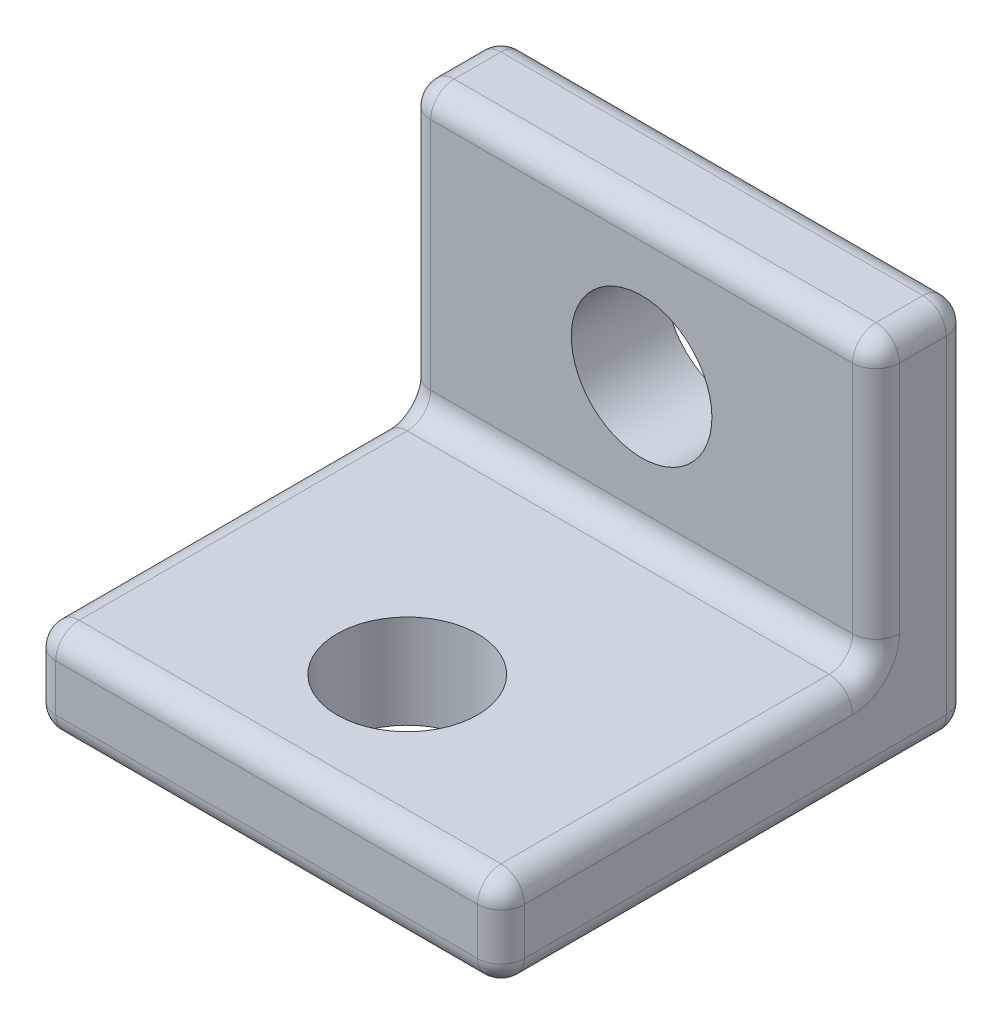
ISO-10303-21;
HEADER;
FILE_DESCRIPTION(('STEP AP214'),'2;1');
FILE_NAME('part.step','',(''),(''),'','','');
FILE_SCHEMA(('AUTOMOTIVE_DESIGN { 1 0 10303 214 1 1 1 1 }'));
ENDSEC;
DATA;
#1=APPLICATION_CONTEXT('core data for automotive mechanical design processes');
#2=APPLICATION_PROTOCOL_DEFINITION('international standard','automotive_design',2000,#1);
#3=PRODUCT_CONTEXT('',#1,'mechanical');
#4=PRODUCT('Part','Part','',(#3));
#5=PRODUCT_RELATED_PRODUCT_CATEGORY('part','',(#4));
#6=PRODUCT_DEFINITION_FORMATION('','',#4);
#7=PRODUCT_DEFINITION_CONTEXT('part definition',#1,'design');
#8=PRODUCT_DEFINITION('design','',#6,#7);
#9=PRODUCT_DEFINITION_SHAPE('','',#8);
#10=(LENGTH_UNIT() NAMED_UNIT(*) SI_UNIT(.MILLI.,.METRE.));
#11=(NAMED_UNIT(*) PLANE_ANGLE_UNIT() SI_UNIT($,.RADIAN.));
#12=(NAMED_UNIT(*) SI_UNIT($,.STERADIAN.) SOLID_ANGLE_UNIT());
#13=UNCERTAINTY_MEASURE_WITH_UNIT(LENGTH_MEASURE(1.E-05),#10,'distance_accuracy_value','');
#14=(GEOMETRIC_REPRESENTATION_CONTEXT(3) GLOBAL_UNCERTAINTY_ASSIGNED_CONTEXT((#13)) GLOBAL_UNIT_ASSIGNED_CONTEXT((#10,
#11,#12)) REPRESENTATION_CONTEXT('',''));
#15=CARTESIAN_POINT('',(0.,0.,0.));
#16=DIRECTION('',(0.,0.,1.));
#17=DIRECTION('',(1.,0.,0.));
#18=AXIS2_PLACEMENT_3D('',#15,#16,#17);
#19=CARTESIAN_POINT('',(5.,2.,-4.));
#20=DIRECTION('',(-1.,0.,0.));
#21=DIRECTION('',(0.,0.,1.));
#22=AXIS2_PLACEMENT_3D('',#19,#20,#21);
#23=PLANE('',#22);
#24=DIRECTION('',(0.,0.,-1.));
#25=VECTOR('',#24,1.);
#26=CARTESIAN_POINT('',(5.,0.5,-4.));
#27=LINE('',#26,#25);
#28=CARTESIAN_POINT('',(5.,0.5,3.5));
#29=VERTEX_POINT('',#28);
#30=CARTESIAN_POINT('',(5.,0.5,-5.5));
#31=VERTEX_POINT('',#30);
#32=EDGE_CURVE('E261',#29,#31,#27,.T.);
#33=ORIENTED_EDGE('',*,*,#32,.T.);
#34=DIRECTION('',(0.,-1.,0.));
#35=VECTOR('',#34,1.);
#36=CARTESIAN_POINT('',(5.,2.,-5.5));
#37=LINE('',#36,#35);
#38=CARTESIAN_POINT('',(5.,7.5,-5.5));
#39=VERTEX_POINT('',#38);
#40=EDGE_CURVE('E265',#31,#39,#37,.F.);
#41=ORIENTED_EDGE('',*,*,#40,.T.);
#42=DIRECTION('',(0.,0.,-1.));
#43=VECTOR('',#42,1.);
#44=CARTESIAN_POINT('',(5.,7.5,-4.));
#45=LINE('',#44,#43);
#46=CARTESIAN_POINT('',(5.,7.5,-4.5));
#47=VERTEX_POINT('',#46);
#48=EDGE_CURVE('E258',#39,#47,#45,.F.);
#49=ORIENTED_EDGE('',*,*,#48,.T.);
#50=DIRECTION('',(0.,-1.,0.));
#51=VECTOR('',#50,1.);
#52=CARTESIAN_POINT('',(5.,2.,-4.5));
#53=LINE('',#52,#51);
#54=CARTESIAN_POINT('',(5.,2.5,-4.5));
#55=VERTEX_POINT('',#54);
#56=EDGE_CURVE('E255',#47,#55,#53,.T.);
#57=ORIENTED_EDGE('',*,*,#56,.T.);
#58=CARTESIAN_POINT('',(5.,2.5,-3.5));
#59=DIRECTION('',(-1.,0.,0.));
#60=DIRECTION('',(0.,0.,1.));
#61=AXIS2_PLACEMENT_3D('',#58,#59,#60);
#62=CIRCLE('',#61,1.);
#63=CARTESIAN_POINT('',(5.,1.5,-3.5));
#64=VERTEX_POINT('',#63);
#65=EDGE_CURVE('E251',#64,#55,#62,.F.);
#66=ORIENTED_EDGE('',*,*,#65,.F.);
#67=DIRECTION('',(0.,0.,-1.));
#68=VECTOR('',#67,1.);
#69=CARTESIAN_POINT('',(5.,1.5,4.));
#70=LINE('',#69,#68);
#71=CARTESIAN_POINT('',(5.,1.5,3.5));
#72=VERTEX_POINT('',#71);
#73=EDGE_CURVE('E248',#64,#72,#70,.F.);
#74=ORIENTED_EDGE('',*,*,#73,.T.);
#75=DIRECTION('',(0.,-1.,0.));
#76=VECTOR('',#75,1.);
#77=CARTESIAN_POINT('',(5.,2.,3.5));
#78=LINE('',#77,#76);
#79=EDGE_CURVE('E245',#72,#29,#78,.T.);
#80=ORIENTED_EDGE('',*,*,#79,.T.);
#81=EDGE_LOOP('',(#33,#41,#49,#57,#66,#74,#80));
#82=FACE_BOUND('',#81,.T.);
#83=ADVANCED_FACE('F45',(#82),#23,.F.);
#84=CARTESIAN_POINT('',(-5.,2.,-4.));
#85=DIRECTION('',(1.,0.,0.));
#86=DIRECTION('',(0.,0.,-1.));
#87=AXIS2_PLACEMENT_3D('',#84,#85,#86);
#88=PLANE('',#87);
#89=DIRECTION('',(0.,-1.,0.));
#90=VECTOR('',#89,1.);
#91=CARTESIAN_POINT('',(-5.,2.,-4.5));
#92=LINE('',#91,#90);
#93=CARTESIAN_POINT('',(-5.,2.5,-4.5));
#94=VERTEX_POINT('',#93);
#95=CARTESIAN_POINT('',(-5.,7.5,-4.5));
#96=VERTEX_POINT('',#95);
#97=EDGE_CURVE('E295',#94,#96,#92,.F.);
#98=ORIENTED_EDGE('',*,*,#97,.T.);
#99=DIRECTION('',(0.,0.,1.));
#100=VECTOR('',#99,1.);
#101=CARTESIAN_POINT('',(-5.,7.5,-6.));
#102=LINE('',#101,#100);
#103=CARTESIAN_POINT('',(-5.,7.5,-5.5));
#104=VERTEX_POINT('',#103);
#105=EDGE_CURVE('E301',#96,#104,#102,.F.);
#106=ORIENTED_EDGE('',*,*,#105,.T.);
#107=DIRECTION('',(0.,-1.,0.));
#108=VECTOR('',#107,1.);
#109=CARTESIAN_POINT('',(-5.,2.,-5.5));
#110=LINE('',#109,#108);
#111=CARTESIAN_POINT('',(-5.,0.5,-5.5));
#112=VERTEX_POINT('',#111);
#113=EDGE_CURVE('E298',#104,#112,#110,.T.);
#114=ORIENTED_EDGE('',*,*,#113,.T.);
#115=DIRECTION('',(0.,0.,1.));
#116=VECTOR('',#115,1.);
#117=CARTESIAN_POINT('',(-5.,0.5,-4.));
#118=LINE('',#117,#116);
#119=CARTESIAN_POINT('',(-5.,0.5,3.5));
#120=VERTEX_POINT('',#119);
#121=EDGE_CURVE('E287',#112,#120,#118,.T.);
#122=ORIENTED_EDGE('',*,*,#121,.T.);
#123=DIRECTION('',(0.,-1.,0.));
#124=VECTOR('',#123,1.);
#125=CARTESIAN_POINT('',(-5.,2.,3.5));
#126=LINE('',#125,#124);
#127=CARTESIAN_POINT('',(-5.,1.5,3.5));
#128=VERTEX_POINT('',#127);
#129=EDGE_CURVE('E281',#120,#128,#126,.F.);
#130=ORIENTED_EDGE('',*,*,#129,.T.);
#131=DIRECTION('',(0.,0.,1.));
#132=VECTOR('',#131,1.);
#133=CARTESIAN_POINT('',(-5.,1.5,-4.));
#134=LINE('',#133,#132);
#135=CARTESIAN_POINT('',(-5.,1.5,-3.5));
#136=VERTEX_POINT('',#135);
#137=EDGE_CURVE('E284',#128,#136,#134,.F.);
#138=ORIENTED_EDGE('',*,*,#137,.T.);
#139=CARTESIAN_POINT('',(-5.,2.5,-3.5));
#140=DIRECTION('',(1.,0.,0.));
#141=DIRECTION('',(0.,0.,-1.));
#142=AXIS2_PLACEMENT_3D('',#139,#140,#141);
#143=CIRCLE('',#142,1.);
#144=EDGE_CURVE('E291',#94,#136,#143,.F.);
#145=ORIENTED_EDGE('',*,*,#144,.F.);
#146=EDGE_LOOP('',(#98,#106,#114,#122,#130,#138,#145));
#147=FACE_BOUND('',#146,.T.);
#148=ADVANCED_FACE('F488',(#147),#88,.F.);
#149=CARTESIAN_POINT('',(-5.,2.,4.));
#150=DIRECTION('',(0.,0.,-1.));
#151=DIRECTION('',(-1.,0.,0.));
#152=AXIS2_PLACEMENT_3D('',#149,#150,#151);
#153=PLANE('',#152);
#154=DIRECTION('',(0.,-1.,0.));
#155=VECTOR('',#154,1.);
#156=CARTESIAN_POINT('',(-4.5,2.,4.));
#157=LINE('',#156,#155);
#158=CARTESIAN_POINT('',(-4.5,1.5,4.));
#159=VERTEX_POINT('',#158);
#160=CARTESIAN_POINT('',(-4.5,0.5,4.));
#161=VERTEX_POINT('',#160);
#162=EDGE_CURVE('E268',#159,#161,#157,.T.);
#163=ORIENTED_EDGE('',*,*,#162,.T.);
#164=DIRECTION('',(1.,0.,0.));
#165=VECTOR('',#164,1.);
#166=CARTESIAN_POINT('',(-5.,0.5,4.));
#167=LINE('',#166,#165);
#168=CARTESIAN_POINT('',(4.5,0.5,4.));
#169=VERTEX_POINT('',#168);
#170=EDGE_CURVE('E277',#161,#169,#167,.T.);
#171=ORIENTED_EDGE('',*,*,#170,.T.);
#172=DIRECTION('',(0.,-1.,0.));
#173=VECTOR('',#172,1.);
#174=CARTESIAN_POINT('',(4.5,2.,4.));
#175=LINE('',#174,#173);
#176=CARTESIAN_POINT('',(4.5,1.5,4.));
#177=VERTEX_POINT('',#176);
#178=EDGE_CURVE('E274',#169,#177,#175,.F.);
#179=ORIENTED_EDGE('',*,*,#178,.T.);
#180=DIRECTION('',(1.,0.,0.));
#181=VECTOR('',#180,1.);
#182=CARTESIAN_POINT('',(-5.,1.5,4.));
#183=LINE('',#182,#181);
#184=EDGE_CURVE('E271',#177,#159,#183,.F.);
#185=ORIENTED_EDGE('',*,*,#184,.T.);
#186=EDGE_LOOP('',(#163,#171,#179,#185));
#187=FACE_BOUND('',#186,.T.);
#188=ADVANCED_FACE('F480',(#187),#153,.F.);
#189=CARTESIAN_POINT('',(0.,2.,0.));
#190=DIRECTION('',(0.,1.,0.));
#191=DIRECTION('',(0.,0.,1.));
#192=AXIS2_PLACEMENT_3D('',#189,#190,#191);
#193=PLANE('',#192);
#194=DIRECTION('',(1.,0.,0.));
#195=VECTOR('',#194,1.);
#196=CARTESIAN_POINT('',(5.,2.,3.5));
#197=LINE('',#196,#195);
#198=CARTESIAN_POINT('',(-4.5,2.,3.5));
#199=VERTEX_POINT('',#198);
#200=CARTESIAN_POINT('',(4.5,2.,3.5));
#201=VERTEX_POINT('',#200);
#202=EDGE_CURVE('E55',#199,#201,#197,.T.);
#203=ORIENTED_EDGE('',*,*,#202,.T.);
#204=DIRECTION('',(0.,0.,-1.));
#205=VECTOR('',#204,1.);
#206=CARTESIAN_POINT('',(4.5,2.,-4.));
#207=LINE('',#206,#205);
#208=CARTESIAN_POINT('',(4.5,2.,-3.5));
#209=VERTEX_POINT('',#208);
#210=EDGE_CURVE('E11',#201,#209,#207,.T.);
#211=ORIENTED_EDGE('',*,*,#210,.T.);
#212=DIRECTION('',(-1.,0.,0.));
#213=VECTOR('',#212,1.);
#214=CARTESIAN_POINT('',(0.,2.,-3.5));
#215=LINE('',#214,#213);
#216=CARTESIAN_POINT('',(-4.5,2.,-3.5));
#217=VERTEX_POINT('',#216);
#218=EDGE_CURVE('E332',#209,#217,#215,.T.);
#219=ORIENTED_EDGE('',*,*,#218,.T.);
#220=DIRECTION('',(0.,0.,1.));
#221=VECTOR('',#220,1.);
#222=CARTESIAN_POINT('',(-4.5,2.,4.));
#223=LINE('',#222,#221);
#224=EDGE_CURVE('E329',#217,#199,#223,.T.);
#225=ORIENTED_EDGE('',*,*,#224,.T.);
#226=EDGE_LOOP('',(#203,#211,#219,#225));
#227=FACE_BOUND('',#226,.T.);
#228=CARTESIAN_POINT('',(0.,2.,1.));
#229=DIRECTION('',(0.,1.,0.));
#230=DIRECTION('',(0.,0.,1.));
#231=AXIS2_PLACEMENT_3D('',#228,#229,#230);
#232=CIRCLE('',#231,1.5);
#233=CARTESIAN_POINT('',(0.,2.,2.5));
#234=VERTEX_POINT('',#233);
#235=EDGE_CURVE('E223',#234,#234,#232,.T.);
#236=ORIENTED_EDGE('',*,*,#235,.F.);
#237=EDGE_LOOP('',(#236));
#238=FACE_BOUND('',#237,.T.);
#239=ADVANCED_FACE('F477',(#227,#238),#193,.T.);
#240=CARTESIAN_POINT('',(0.,0.,0.));
#241=DIRECTION('',(0.,1.,0.));
#242=DIRECTION('',(0.,0.,1.));
#243=AXIS2_PLACEMENT_3D('',#240,#241,#242);
#244=PLANE('',#243);
#245=DIRECTION('',(0.,0.,1.));
#246=VECTOR('',#245,1.);
#247=CARTESIAN_POINT('',(-4.5,0.,0.));
#248=LINE('',#247,#246);
#249=CARTESIAN_POINT('',(-4.5,0.,3.5));
#250=VERTEX_POINT('',#249);
#251=CARTESIAN_POINT('',(-4.5,0.,-5.5));
#252=VERTEX_POINT('',#251);
#253=EDGE_CURVE('E232',#250,#252,#248,.F.);
#254=ORIENTED_EDGE('',*,*,#253,.T.);
#255=DIRECTION('',(-1.,0.,0.));
#256=VECTOR('',#255,1.);
#257=CARTESIAN_POINT('',(0.,0.,-5.5));
#258=LINE('',#257,#256);
#259=CARTESIAN_POINT('',(4.5,0.,-5.5));
#260=VERTEX_POINT('',#259);
#261=EDGE_CURVE('E241',#252,#260,#258,.F.);
#262=ORIENTED_EDGE('',*,*,#261,.T.);
#263=DIRECTION('',(0.,0.,-1.));
#264=VECTOR('',#263,1.);
#265=CARTESIAN_POINT('',(4.5,0.,0.));
#266=LINE('',#265,#264);
#267=CARTESIAN_POINT('',(4.5,0.,3.5));
#268=VERTEX_POINT('',#267);
#269=EDGE_CURVE('E238',#260,#268,#266,.F.);
#270=ORIENTED_EDGE('',*,*,#269,.T.);
#271=DIRECTION('',(1.,0.,0.));
#272=VECTOR('',#271,1.);
#273=CARTESIAN_POINT('',(0.,0.,3.5));
#274=LINE('',#273,#272);
#275=EDGE_CURVE('E235',#268,#250,#274,.F.);
#276=ORIENTED_EDGE('',*,*,#275,.T.);
#277=EDGE_LOOP('',(#254,#262,#270,#276));
#278=FACE_BOUND('',#277,.T.);
#279=CARTESIAN_POINT('',(0.,0.,1.));
#280=DIRECTION('',(0.,1.,0.));
#281=DIRECTION('',(0.,0.,1.));
#282=AXIS2_PLACEMENT_3D('',#279,#280,#281);
#283=CIRCLE('',#282,1.5);
#284=CARTESIAN_POINT('',(0.,0.,2.5));
#285=VERTEX_POINT('',#284);
#286=EDGE_CURVE('E219',#285,#285,#283,.T.);
#287=ORIENTED_EDGE('',*,*,#286,.T.);
#288=EDGE_LOOP('',(#287));
#289=FACE_BOUND('',#288,.T.);
#290=ADVANCED_FACE('F479',(#278,#289),#244,.F.);
#291=CARTESIAN_POINT('',(-5.,8.,-6.));
#292=DIRECTION('',(0.,0.,1.));
#293=DIRECTION('',(1.,0.,0.));
#294=AXIS2_PLACEMENT_3D('',#291,#292,#293);
#295=PLANE('',#294);
#296=DIRECTION('',(0.,-1.,0.));
#297=VECTOR('',#296,1.);
#298=CARTESIAN_POINT('',(4.5,8.,-6.));
#299=LINE('',#298,#297);
#300=CARTESIAN_POINT('',(4.5,7.5,-6.));
#301=VERTEX_POINT('',#300);
#302=CARTESIAN_POINT('',(4.5,0.5,-6.));
#303=VERTEX_POINT('',#302);
#304=EDGE_CURVE('E184',#301,#303,#299,.T.);
#305=ORIENTED_EDGE('',*,*,#304,.T.);
#306=DIRECTION('',(-1.,0.,0.));
#307=VECTOR('',#306,1.);
#308=CARTESIAN_POINT('',(-5.,0.5,-6.));
#309=LINE('',#308,#307);
#310=CARTESIAN_POINT('',(-4.5,0.5,-6.));
#311=VERTEX_POINT('',#310);
#312=EDGE_CURVE('E229',#303,#311,#309,.T.);
#313=ORIENTED_EDGE('',*,*,#312,.T.);
#314=DIRECTION('',(0.,-1.,0.));
#315=VECTOR('',#314,1.);
#316=CARTESIAN_POINT('',(-4.5,8.,-6.));
#317=LINE('',#316,#315);
#318=CARTESIAN_POINT('',(-4.5,7.5,-6.));
#319=VERTEX_POINT('',#318);
#320=EDGE_CURVE('E187',#311,#319,#317,.F.);
#321=ORIENTED_EDGE('',*,*,#320,.T.);
#322=DIRECTION('',(-1.,0.,0.));
#323=VECTOR('',#322,1.);
#324=CARTESIAN_POINT('',(5.,7.5,-6.));
#325=LINE('',#324,#323);
#326=EDGE_CURVE('E178',#319,#301,#325,.F.);
#327=ORIENTED_EDGE('',*,*,#326,.T.);
#328=EDGE_LOOP('',(#305,#313,#321,#327));
#329=FACE_BOUND('',#328,.T.);
#330=CARTESIAN_POINT('',(0.,5.,-6.));
#331=DIRECTION('',(0.,0.,1.));
#332=DIRECTION('',(1.,0.,0.));
#333=AXIS2_PLACEMENT_3D('',#330,#331,#332);
#334=CIRCLE('',#333,1.5);
#335=CARTESIAN_POINT('',(1.5,5.,-6.));
#336=VERTEX_POINT('',#335);
#337=EDGE_CURVE('E463',#336,#336,#334,.T.);
#338=ORIENTED_EDGE('',*,*,#337,.T.);
#339=EDGE_LOOP('',(#338));
#340=FACE_BOUND('',#339,.T.);
#341=ADVANCED_FACE('F180',(#329,#340),#295,.F.);
#342=CARTESIAN_POINT('',(-5.,8.,-4.));
#343=DIRECTION('',(0.,0.,-1.));
#344=DIRECTION('',(-1.,0.,0.));
#345=AXIS2_PLACEMENT_3D('',#342,#343,#344);
#346=PLANE('',#345);
#347=DIRECTION('',(0.,-1.,0.));
#348=VECTOR('',#347,1.);
#349=CARTESIAN_POINT('',(4.5,8.,-4.));
#350=LINE('',#349,#348);
#351=CARTESIAN_POINT('',(4.5,2.5,-4.));
#352=VERTEX_POINT('',#351);
#353=CARTESIAN_POINT('',(4.5,7.5,-4.));
#354=VERTEX_POINT('',#353);
#355=EDGE_CURVE('E322',#352,#354,#350,.F.);
#356=ORIENTED_EDGE('',*,*,#355,.T.);
#357=DIRECTION('',(1.,0.,0.));
#358=VECTOR('',#357,1.);
#359=CARTESIAN_POINT('',(-5.,7.5,-4.));
#360=LINE('',#359,#358);
#361=CARTESIAN_POINT('',(-4.5,7.5,-4.));
#362=VERTEX_POINT('',#361);
#363=EDGE_CURVE('E325',#354,#362,#360,.F.);
#364=ORIENTED_EDGE('',*,*,#363,.T.);
#365=DIRECTION('',(0.,-1.,0.));
#366=VECTOR('',#365,1.);
#367=CARTESIAN_POINT('',(-4.5,8.,-4.));
#368=LINE('',#367,#366);
#369=CARTESIAN_POINT('',(-4.5,2.5,-4.));
#370=VERTEX_POINT('',#369);
#371=EDGE_CURVE('E316',#362,#370,#368,.T.);
#372=ORIENTED_EDGE('',*,*,#371,.T.);
#373=DIRECTION('',(-1.,0.,0.));
#374=VECTOR('',#373,1.);
#375=CARTESIAN_POINT('',(-5.,2.5,-4.));
#376=LINE('',#375,#374);
#377=EDGE_CURVE('E319',#370,#352,#376,.F.);
#378=ORIENTED_EDGE('',*,*,#377,.T.);
#379=EDGE_LOOP('',(#356,#364,#372,#378));
#380=FACE_BOUND('',#379,.T.);
#381=CARTESIAN_POINT('',(0.,5.,-4.));
#382=DIRECTION('',(0.,0.,1.));
#383=DIRECTION('',(1.,0.,0.));
#384=AXIS2_PLACEMENT_3D('',#381,#382,#383);
#385=CIRCLE('',#384,1.5);
#386=CARTESIAN_POINT('',(1.5,5.,-4.));
#387=VERTEX_POINT('',#386);
#388=EDGE_CURVE('E456',#387,#387,#385,.T.);
#389=ORIENTED_EDGE('',*,*,#388,.F.);
#390=EDGE_LOOP('',(#389));
#391=FACE_BOUND('',#390,.T.);
#392=ADVANCED_FACE('F617',(#380,#391),#346,.F.);
#393=CARTESIAN_POINT('',(0.,8.,0.));
#394=DIRECTION('',(0.,1.,0.));
#395=DIRECTION('',(0.,0.,1.));
#396=AXIS2_PLACEMENT_3D('',#393,#394,#395);
#397=PLANE('',#396);
#398=DIRECTION('',(-1.,0.,0.));
#399=VECTOR('',#398,1.);
#400=CARTESIAN_POINT('',(-5.,8.,-5.5));
#401=LINE('',#400,#399);
#402=CARTESIAN_POINT('',(4.5,8.,-5.5));
#403=VERTEX_POINT('',#402);
#404=CARTESIAN_POINT('',(-4.5,8.,-5.5));
#405=VERTEX_POINT('',#404);
#406=EDGE_CURVE('E198',#403,#405,#401,.T.);
#407=ORIENTED_EDGE('',*,*,#406,.T.);
#408=DIRECTION('',(0.,0.,1.));
#409=VECTOR('',#408,1.);
#410=CARTESIAN_POINT('',(-4.5,8.,-4.));
#411=LINE('',#410,#409);
#412=CARTESIAN_POINT('',(-4.5,8.,-4.5));
#413=VERTEX_POINT('',#412);
#414=EDGE_CURVE('E312',#405,#413,#411,.T.);
#415=ORIENTED_EDGE('',*,*,#414,.T.);
#416=DIRECTION('',(1.,0.,0.));
#417=VECTOR('',#416,1.);
#418=CARTESIAN_POINT('',(5.,8.,-4.5));
#419=LINE('',#418,#417);
#420=CARTESIAN_POINT('',(4.5,8.,-4.5));
#421=VERTEX_POINT('',#420);
#422=EDGE_CURVE('E307',#413,#421,#419,.T.);
#423=ORIENTED_EDGE('',*,*,#422,.T.);
#424=DIRECTION('',(0.,0.,-1.));
#425=VECTOR('',#424,1.);
#426=CARTESIAN_POINT('',(4.5,8.,-6.));
#427=LINE('',#426,#425);
#428=EDGE_CURVE('E304',#421,#403,#427,.T.);
#429=ORIENTED_EDGE('',*,*,#428,.T.);
#430=EDGE_LOOP('',(#407,#415,#423,#429));
#431=FACE_BOUND('',#430,.T.);
#432=ADVANCED_FACE('F642',(#431),#397,.T.);
#433=CARTESIAN_POINT('',(0.,0.,1.));
#434=DIRECTION('',(0.,1.,0.));
#435=DIRECTION('',(0.,0.,1.));
#436=AXIS2_PLACEMENT_3D('',#433,#434,#435);
#437=CYLINDRICAL_SURFACE('',#436,1.5);
#438=ORIENTED_EDGE('',*,*,#286,.F.);
#439=EDGE_LOOP('',(#438));
#440=FACE_BOUND('',#439,.T.);
#441=ORIENTED_EDGE('',*,*,#235,.T.);
#442=EDGE_LOOP('',(#441));
#443=FACE_BOUND('',#442,.T.);
#444=ADVANCED_FACE('F475',(#440,#443),#437,.F.);
#445=CARTESIAN_POINT('',(0.,5.,-6.));
#446=DIRECTION('',(0.,0.,1.));
#447=DIRECTION('',(1.,0.,0.));
#448=AXIS2_PLACEMENT_3D('',#445,#446,#447);
#449=CYLINDRICAL_SURFACE('',#448,1.5);
#450=ORIENTED_EDGE('',*,*,#337,.F.);
#451=EDGE_LOOP('',(#450));
#452=FACE_BOUND('',#451,.T.);
#453=ORIENTED_EDGE('',*,*,#388,.T.);
#454=EDGE_LOOP('',(#453));
#455=FACE_BOUND('',#454,.T.);
#456=ADVANCED_FACE('F610',(#452,#455),#449,.F.);
#457=CARTESIAN_POINT('',(0.,2.5,-3.5));
#458=DIRECTION('',(-1.,0.,0.));
#459=DIRECTION('',(0.,0.,1.));
#460=AXIS2_PLACEMENT_3D('',#457,#458,#459);
#461=CYLINDRICAL_SURFACE('',#460,0.5);
#462=CARTESIAN_POINT('',(4.5,2.5,-3.5));
#463=DIRECTION('',(-1.,0.,0.));
#464=DIRECTION('',(0.,0.,1.));
#465=AXIS2_PLACEMENT_3D('',#462,#463,#464);
#466=CIRCLE('',#465,0.5);
#467=EDGE_CURVE('E49',#352,#209,#466,.T.);
#468=ORIENTED_EDGE('',*,*,#467,.F.);
#469=ORIENTED_EDGE('',*,*,#377,.F.);
#470=CARTESIAN_POINT('',(-4.5,2.5,-3.5));
#471=DIRECTION('',(1.,0.,0.));
#472=DIRECTION('',(0.,0.,-1.));
#473=AXIS2_PLACEMENT_3D('',#470,#471,#472);
#474=CIRCLE('',#473,0.5);
#475=EDGE_CURVE('E448',#217,#370,#474,.T.);
#476=ORIENTED_EDGE('',*,*,#475,.F.);
#477=ORIENTED_EDGE('',*,*,#218,.F.);
#478=EDGE_LOOP('',(#468,#469,#476,#477));
#479=FACE_BOUND('',#478,.T.);
#480=ADVANCED_FACE('F47',(#479),#461,.F.);
#481=CARTESIAN_POINT('',(4.5,2.5,-3.5));
#482=DIRECTION('',(-1.,0.,0.));
#483=DIRECTION('',(0.,0.,1.));
#484=AXIS2_PLACEMENT_3D('',#481,#482,#483);
#485=TOROIDAL_SURFACE('',#484,1.,0.5);
#486=CARTESIAN_POINT('',(4.5,2.5,-4.5));
#487=DIRECTION('',(0.,-1.,0.));
#488=DIRECTION('',(0.,0.,-1.));
#489=AXIS2_PLACEMENT_3D('',#486,#487,#488);
#490=CIRCLE('',#489,0.5);
#491=EDGE_CURVE('E443',#352,#55,#490,.F.);
#492=ORIENTED_EDGE('',*,*,#491,.F.);
#493=ORIENTED_EDGE('',*,*,#467,.T.);
#494=CARTESIAN_POINT('',(4.5,1.5,-3.5));
#495=DIRECTION('',(0.,0.,-1.));
#496=DIRECTION('',(-1.,0.,0.));
#497=AXIS2_PLACEMENT_3D('',#494,#495,#496);
#498=CIRCLE('',#497,0.5);
#499=EDGE_CURVE('E68',#64,#209,#498,.F.);
#500=ORIENTED_EDGE('',*,*,#499,.F.);
#501=ORIENTED_EDGE('',*,*,#65,.T.);
#502=EDGE_LOOP('',(#492,#493,#500,#501));
#503=FACE_BOUND('',#502,.T.);
#504=ADVANCED_FACE('F605',(#503),#485,.T.);
#505=CARTESIAN_POINT('',(-4.5,2.5,-3.5));
#506=DIRECTION('',(1.,0.,0.));
#507=DIRECTION('',(0.,0.,-1.));
#508=AXIS2_PLACEMENT_3D('',#505,#506,#507);
#509=TOROIDAL_SURFACE('',#508,1.,0.5);
#510=CARTESIAN_POINT('',(-4.5,1.5,-3.5));
#511=DIRECTION('',(0.,0.,-1.));
#512=DIRECTION('',(-1.,0.,0.));
#513=AXIS2_PLACEMENT_3D('',#510,#511,#512);
#514=CIRCLE('',#513,0.5);
#515=EDGE_CURVE('E435',#217,#136,#514,.F.);
#516=ORIENTED_EDGE('',*,*,#515,.F.);
#517=ORIENTED_EDGE('',*,*,#475,.T.);
#518=CARTESIAN_POINT('',(-4.5,2.5,-4.5));
#519=DIRECTION('',(0.,-1.,0.));
#520=DIRECTION('',(0.,0.,-1.));
#521=AXIS2_PLACEMENT_3D('',#518,#519,#520);
#522=CIRCLE('',#521,0.5);
#523=EDGE_CURVE('E439',#94,#370,#522,.F.);
#524=ORIENTED_EDGE('',*,*,#523,.F.);
#525=ORIENTED_EDGE('',*,*,#144,.T.);
#526=EDGE_LOOP('',(#516,#517,#524,#525));
#527=FACE_BOUND('',#526,.T.);
#528=ADVANCED_FACE('F603',(#527),#509,.T.);
#529=CARTESIAN_POINT('',(4.5,1.5,0.));
#530=DIRECTION('',(0.,0.,1.));
#531=DIRECTION('',(1.,0.,0.));
#532=AXIS2_PLACEMENT_3D('',#529,#530,#531);
#533=CYLINDRICAL_SURFACE('',#532,0.5);
#534=ORIENTED_EDGE('',*,*,#499,.T.);
#535=ORIENTED_EDGE('',*,*,#210,.F.);
#536=CARTESIAN_POINT('',(4.5,1.5,3.5));
#537=DIRECTION('',(0.,0.,1.));
#538=DIRECTION('',(0.,-1.,0.));
#539=AXIS2_PLACEMENT_3D('',#536,#537,#538);
#540=CIRCLE('',#539,0.5);
#541=EDGE_CURVE('E427',#72,#201,#540,.T.);
#542=ORIENTED_EDGE('',*,*,#541,.F.);
#543=ORIENTED_EDGE('',*,*,#73,.F.);
#544=EDGE_LOOP('',(#534,#535,#542,#543));
#545=FACE_BOUND('',#544,.T.);
#546=ADVANCED_FACE('F599',(#545),#533,.T.);
#547=CARTESIAN_POINT('',(4.5,2.,-4.5));
#548=DIRECTION('',(0.,-1.,0.));
#549=DIRECTION('',(0.,0.,-1.));
#550=AXIS2_PLACEMENT_3D('',#547,#548,#549);
#551=CYLINDRICAL_SURFACE('',#550,0.5);
#552=ORIENTED_EDGE('',*,*,#491,.T.);
#553=ORIENTED_EDGE('',*,*,#56,.F.);
#554=CARTESIAN_POINT('',(4.5,7.5,-4.5));
#555=DIRECTION('',(0.,1.,0.));
#556=DIRECTION('',(0.,0.,1.));
#557=AXIS2_PLACEMENT_3D('',#554,#555,#556);
#558=CIRCLE('',#557,0.5);
#559=EDGE_CURVE('E423',#354,#47,#558,.T.);
#560=ORIENTED_EDGE('',*,*,#559,.F.);
#561=ORIENTED_EDGE('',*,*,#355,.F.);
#562=EDGE_LOOP('',(#552,#553,#560,#561));
#563=FACE_BOUND('',#562,.T.);
#564=ADVANCED_FACE('F595',(#563),#551,.T.);
#565=CARTESIAN_POINT('',(0.,7.5,-4.5));
#566=DIRECTION('',(-1.,0.,0.));
#567=DIRECTION('',(0.,0.,1.));
#568=AXIS2_PLACEMENT_3D('',#565,#566,#567);
#569=CYLINDRICAL_SURFACE('',#568,0.5);
#570=CARTESIAN_POINT('',(-4.5,7.5,-4.5));
#571=DIRECTION('',(-1.,0.,0.));
#572=DIRECTION('',(0.,0.,1.));
#573=AXIS2_PLACEMENT_3D('',#570,#571,#572);
#574=CIRCLE('',#573,0.5);
#575=EDGE_CURVE('E415',#362,#413,#574,.T.);
#576=ORIENTED_EDGE('',*,*,#575,.F.);
#577=ORIENTED_EDGE('',*,*,#363,.F.);
#578=CARTESIAN_POINT('',(4.5,7.5,-4.5));
#579=DIRECTION('',(1.,0.,0.));
#580=DIRECTION('',(0.,0.,-1.));
#581=AXIS2_PLACEMENT_3D('',#578,#579,#580);
#582=CIRCLE('',#581,0.5);
#583=EDGE_CURVE('E419',#421,#354,#582,.T.);
#584=ORIENTED_EDGE('',*,*,#583,.F.);
#585=ORIENTED_EDGE('',*,*,#422,.F.);
#586=EDGE_LOOP('',(#576,#577,#584,#585));
#587=FACE_BOUND('',#586,.T.);
#588=ADVANCED_FACE('F591',(#587),#569,.T.);
#589=CARTESIAN_POINT('',(-4.5,8.,-4.5));
#590=DIRECTION('',(0.,-1.,0.));
#591=DIRECTION('',(0.,0.,-1.));
#592=AXIS2_PLACEMENT_3D('',#589,#590,#591);
#593=CYLINDRICAL_SURFACE('',#592,0.5);
#594=ORIENTED_EDGE('',*,*,#523,.T.);
#595=ORIENTED_EDGE('',*,*,#371,.F.);
#596=CARTESIAN_POINT('',(-4.5,7.5,-4.5));
#597=DIRECTION('',(0.,1.,0.));
#598=DIRECTION('',(0.,0.,1.));
#599=AXIS2_PLACEMENT_3D('',#596,#597,#598);
#600=CIRCLE('',#599,0.5);
#601=EDGE_CURVE('E412',#96,#362,#600,.T.);
#602=ORIENTED_EDGE('',*,*,#601,.F.);
#603=ORIENTED_EDGE('',*,*,#97,.F.);
#604=EDGE_LOOP('',(#594,#595,#602,#603));
#605=FACE_BOUND('',#604,.T.);
#606=ADVANCED_FACE('F587',(#605),#593,.T.);
#607=CARTESIAN_POINT('',(-4.5,1.5,0.));
#608=DIRECTION('',(0.,0.,-1.));
#609=DIRECTION('',(-1.,0.,0.));
#610=AXIS2_PLACEMENT_3D('',#607,#608,#609);
#611=CYLINDRICAL_SURFACE('',#610,0.5);
#612=ORIENTED_EDGE('',*,*,#515,.T.);
#613=ORIENTED_EDGE('',*,*,#137,.F.);
#614=CARTESIAN_POINT('',(-4.5,1.5,3.5));
#615=DIRECTION('',(0.,0.,1.));
#616=DIRECTION('',(1.,0.,0.));
#617=AXIS2_PLACEMENT_3D('',#614,#615,#616);
#618=CIRCLE('',#617,0.5);
#619=EDGE_CURVE('E408',#199,#128,#618,.T.);
#620=ORIENTED_EDGE('',*,*,#619,.F.);
#621=ORIENTED_EDGE('',*,*,#224,.F.);
#622=EDGE_LOOP('',(#612,#613,#620,#621));
#623=FACE_BOUND('',#622,.T.);
#624=ADVANCED_FACE('F583',(#623),#611,.T.);
#625=CARTESIAN_POINT('',(0.,1.5,3.5));
#626=DIRECTION('',(-1.,0.,0.));
#627=DIRECTION('',(0.,0.,1.));
#628=AXIS2_PLACEMENT_3D('',#625,#626,#627);
#629=CYLINDRICAL_SURFACE('',#628,0.5);
#630=CARTESIAN_POINT('',(4.5,1.5,3.5));
#631=DIRECTION('',(1.,0.,0.));
#632=DIRECTION('',(0.,0.,-1.));
#633=AXIS2_PLACEMENT_3D('',#630,#631,#632);
#634=CIRCLE('',#633,0.5);
#635=EDGE_CURVE('E431',#201,#177,#634,.T.);
#636=ORIENTED_EDGE('',*,*,#635,.F.);
#637=ORIENTED_EDGE('',*,*,#202,.F.);
#638=CARTESIAN_POINT('',(-4.5,1.5,3.5));
#639=DIRECTION('',(-1.,0.,0.));
#640=DIRECTION('',(0.,0.,1.));
#641=AXIS2_PLACEMENT_3D('',#638,#639,#640);
#642=CIRCLE('',#641,0.5);
#643=EDGE_CURVE('E404',#159,#199,#642,.T.);
#644=ORIENTED_EDGE('',*,*,#643,.F.);
#645=ORIENTED_EDGE('',*,*,#184,.F.);
#646=EDGE_LOOP('',(#636,#637,#644,#645));
#647=FACE_BOUND('',#646,.T.);
#648=ADVANCED_FACE('F579',(#647),#629,.T.);
#649=CARTESIAN_POINT('',(4.5,1.5,3.5));
#650=DIRECTION('',(0.,1.,0.));
#651=DIRECTION('',(0.,0.,1.));
#652=AXIS2_PLACEMENT_3D('',#649,#650,#651);
#653=SPHERICAL_SURFACE('',#652,0.5);
#654=ORIENTED_EDGE('',*,*,#541,.T.);
#655=ORIENTED_EDGE('',*,*,#635,.T.);
#656=CARTESIAN_POINT('',(4.5,1.5,3.5));
#657=DIRECTION('',(0.,1.,0.));
#658=DIRECTION('',(0.,0.,1.));
#659=AXIS2_PLACEMENT_3D('',#656,#657,#658);
#660=CIRCLE('',#659,0.5);
#661=EDGE_CURVE('E400',#72,#177,#660,.F.);
#662=ORIENTED_EDGE('',*,*,#661,.F.);
#663=EDGE_LOOP('',(#654,#655,#662));
#664=FACE_BOUND('',#663,.T.);
#665=ADVANCED_FACE('F575',(#664),#653,.T.);
#666=CARTESIAN_POINT('',(4.5,7.5,-4.5));
#667=DIRECTION('',(0.,0.,1.));
#668=DIRECTION('',(1.,0.,0.));
#669=AXIS2_PLACEMENT_3D('',#666,#667,#668);
#670=SPHERICAL_SURFACE('',#669,0.5);
#671=ORIENTED_EDGE('',*,*,#583,.T.);
#672=ORIENTED_EDGE('',*,*,#559,.T.);
#673=CARTESIAN_POINT('',(4.5,7.5,-4.5));
#674=DIRECTION('',(0.,0.,1.));
#675=DIRECTION('',(1.,0.,0.));
#676=AXIS2_PLACEMENT_3D('',#673,#674,#675);
#677=CIRCLE('',#676,0.5);
#678=EDGE_CURVE('E396',#421,#47,#677,.F.);
#679=ORIENTED_EDGE('',*,*,#678,.F.);
#680=EDGE_LOOP('',(#671,#672,#679));
#681=FACE_BOUND('',#680,.T.);
#682=ADVANCED_FACE('F571',(#681),#670,.T.);
#683=CARTESIAN_POINT('',(-4.5,7.5,-4.5));
#684=DIRECTION('',(0.,0.,1.));
#685=DIRECTION('',(1.,0.,0.));
#686=AXIS2_PLACEMENT_3D('',#683,#684,#685);
#687=SPHERICAL_SURFACE('',#686,0.5);
#688=ORIENTED_EDGE('',*,*,#601,.T.);
#689=ORIENTED_EDGE('',*,*,#575,.T.);
#690=CARTESIAN_POINT('',(-4.5,7.5,-4.5));
#691=DIRECTION('',(0.,0.,1.));
#692=DIRECTION('',(1.,0.,0.));
#693=AXIS2_PLACEMENT_3D('',#690,#691,#692);
#694=CIRCLE('',#693,0.5);
#695=EDGE_CURVE('E393',#96,#413,#694,.F.);
#696=ORIENTED_EDGE('',*,*,#695,.F.);
#697=EDGE_LOOP('',(#688,#689,#696));
#698=FACE_BOUND('',#697,.T.);
#699=ADVANCED_FACE('F567',(#698),#687,.T.);
#700=CARTESIAN_POINT('',(-4.5,1.5,3.5));
#701=DIRECTION('',(0.,1.,0.));
#702=DIRECTION('',(0.,0.,1.));
#703=AXIS2_PLACEMENT_3D('',#700,#701,#702);
#704=SPHERICAL_SURFACE('',#703,0.5);
#705=ORIENTED_EDGE('',*,*,#643,.T.);
#706=ORIENTED_EDGE('',*,*,#619,.T.);
#707=CARTESIAN_POINT('',(-4.5,1.5,3.5));
#708=DIRECTION('',(0.,1.,0.));
#709=DIRECTION('',(0.,0.,1.));
#710=AXIS2_PLACEMENT_3D('',#707,#708,#709);
#711=CIRCLE('',#710,0.5);
#712=EDGE_CURVE('E389',#159,#128,#711,.F.);
#713=ORIENTED_EDGE('',*,*,#712,.F.);
#714=EDGE_LOOP('',(#705,#706,#713));
#715=FACE_BOUND('',#714,.T.);
#716=ADVANCED_FACE('F563',(#715),#704,.T.);
#717=CARTESIAN_POINT('',(4.5,2.,3.5));
#718=DIRECTION('',(0.,-1.,0.));
#719=DIRECTION('',(0.,0.,-1.));
#720=AXIS2_PLACEMENT_3D('',#717,#718,#719);
#721=CYLINDRICAL_SURFACE('',#720,0.5);
#722=ORIENTED_EDGE('',*,*,#661,.T.);
#723=ORIENTED_EDGE('',*,*,#178,.F.);
#724=CARTESIAN_POINT('',(4.5,0.5,3.5));
#725=DIRECTION('',(0.,-1.,0.));
#726=DIRECTION('',(0.,0.,-1.));
#727=AXIS2_PLACEMENT_3D('',#724,#725,#726);
#728=CIRCLE('',#727,0.5);
#729=EDGE_CURVE('E382',#29,#169,#728,.T.);
#730=ORIENTED_EDGE('',*,*,#729,.F.);
#731=ORIENTED_EDGE('',*,*,#79,.F.);
#732=EDGE_LOOP('',(#722,#723,#730,#731));
#733=FACE_BOUND('',#732,.T.);
#734=ADVANCED_FACE('F559',(#733),#721,.T.);
#735=CARTESIAN_POINT('',(4.5,7.5,0.));
#736=DIRECTION('',(0.,0.,1.));
#737=DIRECTION('',(1.,0.,0.));
#738=AXIS2_PLACEMENT_3D('',#735,#736,#737);
#739=CYLINDRICAL_SURFACE('',#738,0.5);
#740=ORIENTED_EDGE('',*,*,#678,.T.);
#741=ORIENTED_EDGE('',*,*,#48,.F.);
#742=CARTESIAN_POINT('',(4.5,7.5,-5.5));
#743=DIRECTION('',(0.,0.,-1.));
#744=DIRECTION('',(-1.,0.,0.));
#745=AXIS2_PLACEMENT_3D('',#742,#743,#744);
#746=CIRCLE('',#745,0.5);
#747=EDGE_CURVE('E203',#403,#39,#746,.T.);
#748=ORIENTED_EDGE('',*,*,#747,.F.);
#749=ORIENTED_EDGE('',*,*,#428,.F.);
#750=EDGE_LOOP('',(#740,#741,#748,#749));
#751=FACE_BOUND('',#750,.T.);
#752=ADVANCED_FACE('F556',(#751),#739,.T.);
#753=CARTESIAN_POINT('',(0.,7.5,-5.5));
#754=DIRECTION('',(1.,0.,0.));
#755=DIRECTION('',(0.,0.,-1.));
#756=AXIS2_PLACEMENT_3D('',#753,#754,#755);
#757=CYLINDRICAL_SURFACE('',#756,0.5);
#758=CARTESIAN_POINT('',(-4.5,7.5,-5.5));
#759=DIRECTION('',(-1.,0.,0.));
#760=DIRECTION('',(0.,0.,1.));
#761=AXIS2_PLACEMENT_3D('',#758,#759,#760);
#762=CIRCLE('',#761,0.5);
#763=EDGE_CURVE('E204',#405,#319,#762,.T.);
#764=ORIENTED_EDGE('',*,*,#763,.F.);
#765=ORIENTED_EDGE('',*,*,#406,.F.);
#766=CARTESIAN_POINT('',(4.5,7.5,-5.5));
#767=DIRECTION('',(1.,0.,0.));
#768=DIRECTION('',(0.,0.,-1.));
#769=AXIS2_PLACEMENT_3D('',#766,#767,#768);
#770=CIRCLE('',#769,0.5);
#771=EDGE_CURVE('E195',#301,#403,#770,.T.);
#772=ORIENTED_EDGE('',*,*,#771,.F.);
#773=ORIENTED_EDGE('',*,*,#326,.F.);
#774=EDGE_LOOP('',(#764,#765,#772,#773));
#775=FACE_BOUND('',#774,.T.);
#776=ADVANCED_FACE('F197',(#775),#757,.T.);
#777=CARTESIAN_POINT('',(-4.5,7.5,0.));
#778=DIRECTION('',(0.,0.,-1.));
#779=DIRECTION('',(-1.,0.,0.));
#780=AXIS2_PLACEMENT_3D('',#777,#778,#779);
#781=CYLINDRICAL_SURFACE('',#780,0.5);
#782=ORIENTED_EDGE('',*,*,#695,.T.);
#783=ORIENTED_EDGE('',*,*,#414,.F.);
#784=CARTESIAN_POINT('',(-4.5,7.5,-5.5));
#785=DIRECTION('',(0.,0.,-1.));
#786=DIRECTION('',(-1.,0.,0.));
#787=AXIS2_PLACEMENT_3D('',#784,#785,#786);
#788=CIRCLE('',#787,0.5);
#789=EDGE_CURVE('E374',#104,#405,#788,.T.);
#790=ORIENTED_EDGE('',*,*,#789,.F.);
#791=ORIENTED_EDGE('',*,*,#105,.F.);
#792=EDGE_LOOP('',(#782,#783,#790,#791));
#793=FACE_BOUND('',#792,.T.);
#794=ADVANCED_FACE('F549',(#793),#781,.T.);
#795=CARTESIAN_POINT('',(-4.5,2.,3.5));
#796=DIRECTION('',(0.,-1.,0.));
#797=DIRECTION('',(0.,0.,-1.));
#798=AXIS2_PLACEMENT_3D('',#795,#796,#797);
#799=CYLINDRICAL_SURFACE('',#798,0.5);
#800=ORIENTED_EDGE('',*,*,#712,.T.);
#801=ORIENTED_EDGE('',*,*,#129,.F.);
#802=CARTESIAN_POINT('',(-4.5,0.5,3.5));
#803=DIRECTION('',(0.,-1.,0.));
#804=DIRECTION('',(0.,0.,-1.));
#805=AXIS2_PLACEMENT_3D('',#802,#803,#804);
#806=CIRCLE('',#805,0.5);
#807=EDGE_CURVE('E370',#161,#120,#806,.T.);
#808=ORIENTED_EDGE('',*,*,#807,.F.);
#809=ORIENTED_EDGE('',*,*,#162,.F.);
#810=EDGE_LOOP('',(#800,#801,#808,#809));
#811=FACE_BOUND('',#810,.T.);
#812=ADVANCED_FACE('F545',(#811),#799,.T.);
#813=CARTESIAN_POINT('',(-5.,0.5,3.5));
#814=DIRECTION('',(1.,0.,0.));
#815=DIRECTION('',(0.,0.,-1.));
#816=AXIS2_PLACEMENT_3D('',#813,#814,#815);
#817=CYLINDRICAL_SURFACE('',#816,0.5);
#818=CARTESIAN_POINT('',(4.5,0.5,3.5));
#819=DIRECTION('',(1.,0.,0.));
#820=DIRECTION('',(0.,0.,-1.));
#821=AXIS2_PLACEMENT_3D('',#818,#819,#820);
#822=CIRCLE('',#821,0.5);
#823=EDGE_CURVE('E385',#169,#268,#822,.T.);
#824=ORIENTED_EDGE('',*,*,#823,.F.);
#825=ORIENTED_EDGE('',*,*,#170,.F.);
#826=CARTESIAN_POINT('',(-4.5,0.5,3.5));
#827=DIRECTION('',(-1.,0.,0.));
#828=DIRECTION('',(0.,0.,1.));
#829=AXIS2_PLACEMENT_3D('',#826,#827,#828);
#830=CIRCLE('',#829,0.5);
#831=EDGE_CURVE('E366',#250,#161,#830,.T.);
#832=ORIENTED_EDGE('',*,*,#831,.F.);
#833=ORIENTED_EDGE('',*,*,#275,.F.);
#834=EDGE_LOOP('',(#824,#825,#832,#833));
#835=FACE_BOUND('',#834,.T.);
#836=ADVANCED_FACE('F541',(#835),#817,.T.);
#837=CARTESIAN_POINT('',(4.5,0.5,3.5));
#838=DIRECTION('',(0.,0.,1.));
#839=DIRECTION('',(1.,0.,0.));
#840=AXIS2_PLACEMENT_3D('',#837,#838,#839);
#841=SPHERICAL_SURFACE('',#840,0.5);
#842=ORIENTED_EDGE('',*,*,#729,.T.);
#843=ORIENTED_EDGE('',*,*,#823,.T.);
#844=CARTESIAN_POINT('',(4.5,0.5,3.5));
#845=DIRECTION('',(0.,0.,1.));
#846=DIRECTION('',(1.,0.,0.));
#847=AXIS2_PLACEMENT_3D('',#844,#845,#846);
#848=CIRCLE('',#847,0.5);
#849=EDGE_CURVE('E212',#29,#268,#848,.F.);
#850=ORIENTED_EDGE('',*,*,#849,.F.);
#851=EDGE_LOOP('',(#842,#843,#850));
#852=FACE_BOUND('',#851,.T.);
#853=ADVANCED_FACE('F538',(#852),#841,.T.);
#854=CARTESIAN_POINT('',(4.5,7.5,-5.5));
#855=DIRECTION('',(0.,1.,0.));
#856=DIRECTION('',(0.,0.,1.));
#857=AXIS2_PLACEMENT_3D('',#854,#855,#856);
#858=SPHERICAL_SURFACE('',#857,0.5);
#859=ORIENTED_EDGE('',*,*,#771,.T.);
#860=ORIENTED_EDGE('',*,*,#747,.T.);
#861=CARTESIAN_POINT('',(4.5,7.5,-5.5));
#862=DIRECTION('',(0.,1.,0.));
#863=DIRECTION('',(0.,0.,1.));
#864=AXIS2_PLACEMENT_3D('',#861,#862,#863);
#865=CIRCLE('',#864,0.5);
#866=EDGE_CURVE('E207',#301,#39,#865,.F.);
#867=ORIENTED_EDGE('',*,*,#866,.F.);
#868=EDGE_LOOP('',(#859,#860,#867));
#869=FACE_BOUND('',#868,.T.);
#870=ADVANCED_FACE('F208',(#869),#858,.T.);
#871=CARTESIAN_POINT('',(-4.5,7.5,-5.5));
#872=DIRECTION('',(0.,1.,0.));
#873=DIRECTION('',(0.,0.,1.));
#874=AXIS2_PLACEMENT_3D('',#871,#872,#873);
#875=SPHERICAL_SURFACE('',#874,0.5);
#876=ORIENTED_EDGE('',*,*,#789,.T.);
#877=ORIENTED_EDGE('',*,*,#763,.T.);
#878=CARTESIAN_POINT('',(-4.5,7.5,-5.5));
#879=DIRECTION('',(0.,1.,0.));
#880=DIRECTION('',(0.,0.,1.));
#881=AXIS2_PLACEMENT_3D('',#878,#879,#880);
#882=CIRCLE('',#881,0.5);
#883=EDGE_CURVE('E213',#104,#319,#882,.F.);
#884=ORIENTED_EDGE('',*,*,#883,.F.);
#885=EDGE_LOOP('',(#876,#877,#884));
#886=FACE_BOUND('',#885,.T.);
#887=ADVANCED_FACE('F531',(#886),#875,.T.);
#888=CARTESIAN_POINT('',(-4.5,0.5,3.5));
#889=DIRECTION('',(0.,0.,1.));
#890=DIRECTION('',(1.,0.,0.));
#891=AXIS2_PLACEMENT_3D('',#888,#889,#890);
#892=SPHERICAL_SURFACE('',#891,0.5);
#893=ORIENTED_EDGE('',*,*,#831,.T.);
#894=ORIENTED_EDGE('',*,*,#807,.T.);
#895=CARTESIAN_POINT('',(-4.5,0.5,3.5));
#896=DIRECTION('',(0.,0.,1.));
#897=DIRECTION('',(1.,0.,0.));
#898=AXIS2_PLACEMENT_3D('',#895,#896,#897);
#899=CIRCLE('',#898,0.5);
#900=EDGE_CURVE('E357',#250,#120,#899,.F.);
#901=ORIENTED_EDGE('',*,*,#900,.F.);
#902=EDGE_LOOP('',(#893,#894,#901));
#903=FACE_BOUND('',#902,.T.);
#904=ADVANCED_FACE('F527',(#903),#892,.T.);
#905=CARTESIAN_POINT('',(4.5,0.5,-4.));
#906=DIRECTION('',(0.,0.,-1.));
#907=DIRECTION('',(-1.,0.,0.));
#908=AXIS2_PLACEMENT_3D('',#905,#906,#907);
#909=CYLINDRICAL_SURFACE('',#908,0.5);
#910=ORIENTED_EDGE('',*,*,#849,.T.);
#911=ORIENTED_EDGE('',*,*,#269,.F.);
#912=CARTESIAN_POINT('',(4.5,0.5,-5.5));
#913=DIRECTION('',(0.,0.,-1.));
#914=DIRECTION('',(-1.,0.,0.));
#915=AXIS2_PLACEMENT_3D('',#912,#913,#914);
#916=CIRCLE('',#915,0.5);
#917=EDGE_CURVE('E353',#31,#260,#916,.T.);
#918=ORIENTED_EDGE('',*,*,#917,.F.);
#919=ORIENTED_EDGE('',*,*,#32,.F.);
#920=EDGE_LOOP('',(#910,#911,#918,#919));
#921=FACE_BOUND('',#920,.T.);
#922=ADVANCED_FACE('F524',(#921),#909,.T.);
#923=CARTESIAN_POINT('',(4.5,8.,-5.5));
#924=DIRECTION('',(0.,-1.,0.));
#925=DIRECTION('',(0.,0.,-1.));
#926=AXIS2_PLACEMENT_3D('',#923,#924,#925);
#927=CYLINDRICAL_SURFACE('',#926,0.5);
#928=ORIENTED_EDGE('',*,*,#866,.T.);
#929=ORIENTED_EDGE('',*,*,#40,.F.);
#930=CARTESIAN_POINT('',(4.5,0.5,-5.5));
#931=DIRECTION('',(0.,-1.,0.));
#932=DIRECTION('',(1.,0.,0.));
#933=AXIS2_PLACEMENT_3D('',#930,#931,#932);
#934=CIRCLE('',#933,0.5);
#935=EDGE_CURVE('E216',#303,#31,#934,.T.);
#936=ORIENTED_EDGE('',*,*,#935,.F.);
#937=ORIENTED_EDGE('',*,*,#304,.F.);
#938=EDGE_LOOP('',(#928,#929,#936,#937));
#939=FACE_BOUND('',#938,.T.);
#940=ADVANCED_FACE('F215',(#939),#927,.T.);
#941=CARTESIAN_POINT('',(-4.5,2.,-5.5));
#942=DIRECTION('',(0.,-1.,0.));
#943=DIRECTION('',(0.,0.,-1.));
#944=AXIS2_PLACEMENT_3D('',#941,#942,#943);
#945=CYLINDRICAL_SURFACE('',#944,0.5);
#946=ORIENTED_EDGE('',*,*,#883,.T.);
#947=ORIENTED_EDGE('',*,*,#320,.F.);
#948=CARTESIAN_POINT('',(-4.5,0.5,-5.5));
#949=DIRECTION('',(0.,-1.,0.));
#950=DIRECTION('',(0.,0.,-1.));
#951=AXIS2_PLACEMENT_3D('',#948,#949,#950);
#952=CIRCLE('',#951,0.5);
#953=EDGE_CURVE('E347',#112,#311,#952,.T.);
#954=ORIENTED_EDGE('',*,*,#953,.F.);
#955=ORIENTED_EDGE('',*,*,#113,.F.);
#956=EDGE_LOOP('',(#946,#947,#954,#955));
#957=FACE_BOUND('',#956,.T.);
#958=ADVANCED_FACE('F517',(#957),#945,.T.);
#959=CARTESIAN_POINT('',(-4.5,0.5,-4.));
#960=DIRECTION('',(0.,0.,1.));
#961=DIRECTION('',(1.,0.,0.));
#962=AXIS2_PLACEMENT_3D('',#959,#960,#961);
#963=CYLINDRICAL_SURFACE('',#962,0.5);
#964=ORIENTED_EDGE('',*,*,#900,.T.);
#965=ORIENTED_EDGE('',*,*,#121,.F.);
#966=CARTESIAN_POINT('',(-4.5,0.5,-5.5));
#967=DIRECTION('',(0.,0.,-1.));
#968=DIRECTION('',(-1.,0.,0.));
#969=AXIS2_PLACEMENT_3D('',#966,#967,#968);
#970=CIRCLE('',#969,0.5);
#971=EDGE_CURVE('E343',#252,#112,#970,.T.);
#972=ORIENTED_EDGE('',*,*,#971,.F.);
#973=ORIENTED_EDGE('',*,*,#253,.F.);
#974=EDGE_LOOP('',(#964,#965,#972,#973));
#975=FACE_BOUND('',#974,.T.);
#976=ADVANCED_FACE('F513',(#975),#963,.T.);
#977=CARTESIAN_POINT('',(4.5,0.5,-5.5));
#978=DIRECTION('',(1.,0.,0.));
#979=DIRECTION('',(0.,0.,-1.));
#980=AXIS2_PLACEMENT_3D('',#977,#978,#979);
#981=SPHERICAL_SURFACE('',#980,0.5);
#982=ORIENTED_EDGE('',*,*,#935,.T.);
#983=ORIENTED_EDGE('',*,*,#917,.T.);
#984=CARTESIAN_POINT('',(4.5,0.5,-5.5));
#985=DIRECTION('',(1.,0.,0.));
#986=DIRECTION('',(0.,0.,-1.));
#987=AXIS2_PLACEMENT_3D('',#984,#985,#986);
#988=CIRCLE('',#987,0.5);
#989=EDGE_CURVE('E340',#303,#260,#988,.F.);
#990=ORIENTED_EDGE('',*,*,#989,.F.);
#991=EDGE_LOOP('',(#982,#983,#990));
#992=FACE_BOUND('',#991,.T.);
#993=ADVANCED_FACE('F509',(#992),#981,.T.);
#994=CARTESIAN_POINT('',(-4.5,0.5,-5.5));
#995=DIRECTION('',(-1.,0.,0.));
#996=DIRECTION('',(0.,0.,1.));
#997=AXIS2_PLACEMENT_3D('',#994,#995,#996);
#998=SPHERICAL_SURFACE('',#997,0.5);
#999=ORIENTED_EDGE('',*,*,#971,.T.);
#1000=ORIENTED_EDGE('',*,*,#953,.T.);
#1001=CARTESIAN_POINT('',(-4.5,0.5,-5.5));
#1002=DIRECTION('',(-1.,0.,0.));
#1003=DIRECTION('',(0.,0.,1.));
#1004=AXIS2_PLACEMENT_3D('',#1001,#1002,#1003);
#1005=CIRCLE('',#1004,0.5);
#1006=EDGE_CURVE('E337',#252,#311,#1005,.F.);
#1007=ORIENTED_EDGE('',*,*,#1006,.F.);
#1008=EDGE_LOOP('',(#999,#1000,#1007));
#1009=FACE_BOUND('',#1008,.T.);
#1010=ADVANCED_FACE('F505',(#1009),#998,.T.);
#1011=CARTESIAN_POINT('',(-5.,0.5,-5.5));
#1012=DIRECTION('',(-1.,0.,0.));
#1013=DIRECTION('',(0.,0.,1.));
#1014=AXIS2_PLACEMENT_3D('',#1011,#1012,#1013);
#1015=CYLINDRICAL_SURFACE('',#1014,0.5);
#1016=ORIENTED_EDGE('',*,*,#989,.T.);
#1017=ORIENTED_EDGE('',*,*,#261,.F.);
#1018=ORIENTED_EDGE('',*,*,#1006,.T.);
#1019=ORIENTED_EDGE('',*,*,#312,.F.);
#1020=EDGE_LOOP('',(#1016,#1017,#1018,#1019));
#1021=FACE_BOUND('',#1020,.T.);
#1022=ADVANCED_FACE('F502',(#1021),#1015,.T.);
#1023=CLOSED_SHELL('',(#83,#148,#188,#239,#290,#341,#392,#432,#444,#456,#480,#504,#528,#546,
#564,#588,#606,#624,#648,#665,#682,#699,#716,#734,#752,#776,#794,#812,#836,#853,#870,#887,#904,
#922,#940,#958,#976,#993,#1010,#1022));
#1024=MANIFOLD_SOLID_BREP('B2',#1023);
#1025=ADVANCED_BREP_SHAPE_REPRESENTATION('',(#18,#1024),#14);
#1026=SHAPE_DEFINITION_REPRESENTATION(#9,#1025);
ENDSEC;
END-ISO-10303-21;
